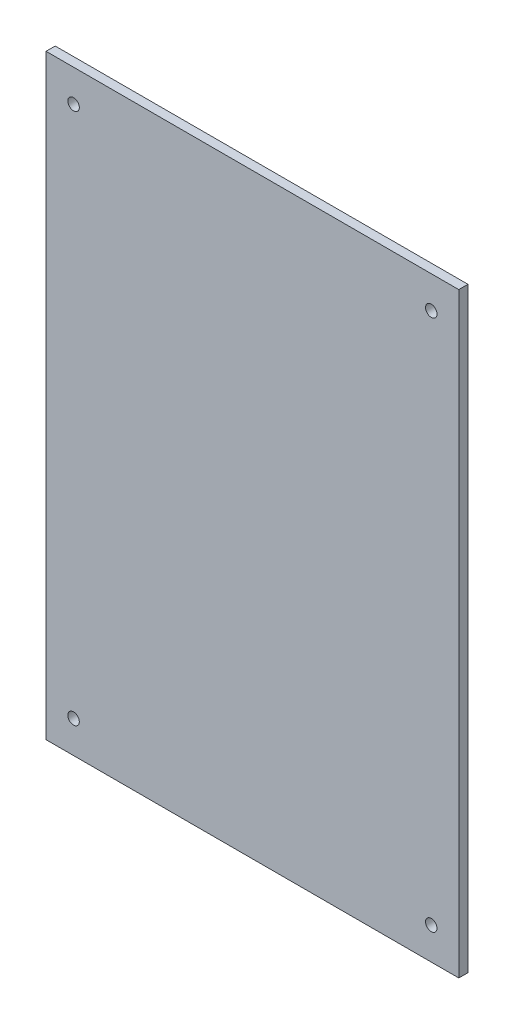
ISO-10303-21;
HEADER;
FILE_DESCRIPTION(('STEP AP214'),'2;1');
FILE_NAME('part.step','',(''),(''),'','','');
FILE_SCHEMA(('AUTOMOTIVE_DESIGN { 1 0 10303 214 1 1 1 1 }'));
ENDSEC;
DATA;
#1=APPLICATION_CONTEXT('core data for automotive mechanical design processes');
#2=APPLICATION_PROTOCOL_DEFINITION('international standard','automotive_design',2000,#1);
#3=PRODUCT_CONTEXT('',#1,'mechanical');
#4=PRODUCT('Part','Part','',(#3));
#5=PRODUCT_RELATED_PRODUCT_CATEGORY('part','',(#4));
#6=PRODUCT_DEFINITION_FORMATION('','',#4);
#7=PRODUCT_DEFINITION_CONTEXT('part definition',#1,'design');
#8=PRODUCT_DEFINITION('design','',#6,#7);
#9=PRODUCT_DEFINITION_SHAPE('','',#8);
#10=(LENGTH_UNIT() NAMED_UNIT(*) SI_UNIT(.MILLI.,.METRE.));
#11=(NAMED_UNIT(*) PLANE_ANGLE_UNIT() SI_UNIT($,.RADIAN.));
#12=(NAMED_UNIT(*) SI_UNIT($,.STERADIAN.) SOLID_ANGLE_UNIT());
#13=UNCERTAINTY_MEASURE_WITH_UNIT(LENGTH_MEASURE(1.E-05),#10,'distance_accuracy_value','');
#14=(GEOMETRIC_REPRESENTATION_CONTEXT(3) GLOBAL_UNCERTAINTY_ASSIGNED_CONTEXT((#13)) GLOBAL_UNIT_ASSIGNED_CONTEXT((#10,
#11,#12)) REPRESENTATION_CONTEXT('',''));
#15=CARTESIAN_POINT('',(0.,0.,0.));
#16=DIRECTION('',(0.,0.,1.));
#17=DIRECTION('',(1.,0.,0.));
#18=AXIS2_PLACEMENT_3D('',#15,#16,#17);
#19=CARTESIAN_POINT('',(0.,0.,4.));
#20=DIRECTION('',(0.,0.,-1.));
#21=DIRECTION('',(-1.,0.,0.));
#22=AXIS2_PLACEMENT_3D('',#19,#20,#21);
#23=PLANE('',#22);
#24=DIRECTION('',(0.,-1.,0.));
#25=VECTOR('',#24,1.);
#26=CARTESIAN_POINT('',(0.,0.,4.));
#27=LINE('',#26,#25);
#28=CARTESIAN_POINT('',(0.,260.,4.));
#29=VERTEX_POINT('',#28);
#30=CARTESIAN_POINT('',(0.,0.,4.));
#31=VERTEX_POINT('',#30);
#32=EDGE_CURVE('E91',#29,#31,#27,.T.);
#33=ORIENTED_EDGE('',*,*,#32,.T.);
#34=DIRECTION('',(1.,0.,0.));
#35=VECTOR('',#34,1.);
#36=CARTESIAN_POINT('',(0.,0.,4.));
#37=LINE('',#36,#35);
#38=CARTESIAN_POINT('',(180.,0.,4.));
#39=VERTEX_POINT('',#38);
#40=EDGE_CURVE('E86',#31,#39,#37,.T.);
#41=ORIENTED_EDGE('',*,*,#40,.T.);
#42=DIRECTION('',(0.,1.,0.));
#43=VECTOR('',#42,1.);
#44=CARTESIAN_POINT('',(180.,0.,4.));
#45=LINE('',#44,#43);
#46=CARTESIAN_POINT('',(180.,260.,4.));
#47=VERTEX_POINT('',#46);
#48=EDGE_CURVE('E87',#39,#47,#45,.T.);
#49=ORIENTED_EDGE('',*,*,#48,.T.);
#50=DIRECTION('',(-1.,0.,0.));
#51=VECTOR('',#50,1.);
#52=CARTESIAN_POINT('',(0.,260.,4.));
#53=LINE('',#52,#51);
#54=EDGE_CURVE('E57',#47,#29,#53,.T.);
#55=ORIENTED_EDGE('',*,*,#54,.T.);
#56=EDGE_LOOP('',(#33,#41,#49,#55));
#57=FACE_BOUND('',#56,.T.);
#58=CARTESIAN_POINT('',(12.,14.,4.));
#59=DIRECTION('',(0.,0.,1.));
#60=DIRECTION('',(1.,0.,0.));
#61=AXIS2_PLACEMENT_3D('',#58,#59,#60);
#62=CIRCLE('',#61,2.5);
#63=CARTESIAN_POINT('',(14.5,14.,4.));
#64=VERTEX_POINT('',#63);
#65=EDGE_CURVE('E106',#64,#64,#62,.T.);
#66=ORIENTED_EDGE('',*,*,#65,.F.);
#67=EDGE_LOOP('',(#66));
#68=FACE_BOUND('',#67,.T.);
#69=CARTESIAN_POINT('',(12.,246.,4.));
#70=DIRECTION('',(0.,0.,1.));
#71=DIRECTION('',(1.,0.,0.));
#72=AXIS2_PLACEMENT_3D('',#69,#70,#71);
#73=CIRCLE('',#72,2.5);
#74=CARTESIAN_POINT('',(14.5,246.,4.));
#75=VERTEX_POINT('',#74);
#76=EDGE_CURVE('E123',#75,#75,#73,.T.);
#77=ORIENTED_EDGE('',*,*,#76,.F.);
#78=EDGE_LOOP('',(#77));
#79=FACE_BOUND('',#78,.T.);
#80=CARTESIAN_POINT('',(168.,14.,4.));
#81=DIRECTION('',(0.,0.,1.));
#82=DIRECTION('',(1.,0.,0.));
#83=AXIS2_PLACEMENT_3D('',#80,#81,#82);
#84=CIRCLE('',#83,2.5);
#85=CARTESIAN_POINT('',(170.5,14.,4.));
#86=VERTEX_POINT('',#85);
#87=EDGE_CURVE('E130',#86,#86,#84,.T.);
#88=ORIENTED_EDGE('',*,*,#87,.F.);
#89=EDGE_LOOP('',(#88));
#90=FACE_BOUND('',#89,.T.);
#91=CARTESIAN_POINT('',(168.,246.,4.));
#92=DIRECTION('',(0.,0.,1.));
#93=DIRECTION('',(1.,0.,0.));
#94=AXIS2_PLACEMENT_3D('',#91,#92,#93);
#95=CIRCLE('',#94,2.5);
#96=CARTESIAN_POINT('',(170.5,246.,4.));
#97=VERTEX_POINT('',#96);
#98=EDGE_CURVE('E133',#97,#97,#95,.T.);
#99=ORIENTED_EDGE('',*,*,#98,.F.);
#100=EDGE_LOOP('',(#99));
#101=FACE_BOUND('',#100,.T.);
#102=ADVANCED_FACE('F39',(#57,#68,#79,#90,#101),#23,.F.);
#103=CARTESIAN_POINT('',(0.,0.,0.));
#104=DIRECTION('',(0.,0.,-1.));
#105=DIRECTION('',(-1.,0.,0.));
#106=AXIS2_PLACEMENT_3D('',#103,#104,#105);
#107=PLANE('',#106);
#108=CARTESIAN_POINT('',(168.,14.,0.));
#109=DIRECTION('',(0.,0.,1.));
#110=DIRECTION('',(1.,0.,0.));
#111=AXIS2_PLACEMENT_3D('',#108,#109,#110);
#112=CIRCLE('',#111,2.5);
#113=CARTESIAN_POINT('',(170.5,14.,0.));
#114=VERTEX_POINT('',#113);
#115=EDGE_CURVE('E127',#114,#114,#112,.T.);
#116=ORIENTED_EDGE('',*,*,#115,.T.);
#117=EDGE_LOOP('',(#116));
#118=FACE_BOUND('',#117,.T.);
#119=CARTESIAN_POINT('',(12.,14.,0.));
#120=DIRECTION('',(0.,0.,1.));
#121=DIRECTION('',(1.,0.,0.));
#122=AXIS2_PLACEMENT_3D('',#119,#120,#121);
#123=CIRCLE('',#122,2.5);
#124=CARTESIAN_POINT('',(14.5,14.,0.));
#125=VERTEX_POINT('',#124);
#126=EDGE_CURVE('E119',#125,#125,#123,.T.);
#127=ORIENTED_EDGE('',*,*,#126,.T.);
#128=EDGE_LOOP('',(#127));
#129=FACE_BOUND('',#128,.T.);
#130=DIRECTION('',(0.,-1.,0.));
#131=VECTOR('',#130,1.);
#132=CARTESIAN_POINT('',(0.,0.,0.));
#133=LINE('',#132,#131);
#134=CARTESIAN_POINT('',(0.,260.,0.));
#135=VERTEX_POINT('',#134);
#136=CARTESIAN_POINT('',(0.,0.,0.));
#137=VERTEX_POINT('',#136);
#138=EDGE_CURVE('E104',#135,#137,#133,.T.);
#139=ORIENTED_EDGE('',*,*,#138,.F.);
#140=DIRECTION('',(-1.,0.,0.));
#141=VECTOR('',#140,1.);
#142=CARTESIAN_POINT('',(0.,260.,0.));
#143=LINE('',#142,#141);
#144=CARTESIAN_POINT('',(180.,260.,0.));
#145=VERTEX_POINT('',#144);
#146=EDGE_CURVE('E80',#145,#135,#143,.T.);
#147=ORIENTED_EDGE('',*,*,#146,.F.);
#148=DIRECTION('',(0.,1.,0.));
#149=VECTOR('',#148,1.);
#150=CARTESIAN_POINT('',(180.,0.,0.));
#151=LINE('',#150,#149);
#152=CARTESIAN_POINT('',(180.,0.,0.));
#153=VERTEX_POINT('',#152);
#154=EDGE_CURVE('E74',#153,#145,#151,.T.);
#155=ORIENTED_EDGE('',*,*,#154,.F.);
#156=DIRECTION('',(1.,0.,0.));
#157=VECTOR('',#156,1.);
#158=CARTESIAN_POINT('',(0.,0.,0.));
#159=LINE('',#158,#157);
#160=EDGE_CURVE('E94',#137,#153,#159,.T.);
#161=ORIENTED_EDGE('',*,*,#160,.F.);
#162=EDGE_LOOP('',(#139,#147,#155,#161));
#163=FACE_BOUND('',#162,.T.);
#164=CARTESIAN_POINT('',(12.,246.,0.));
#165=DIRECTION('',(0.,0.,1.));
#166=DIRECTION('',(1.,0.,0.));
#167=AXIS2_PLACEMENT_3D('',#164,#165,#166);
#168=CIRCLE('',#167,2.5);
#169=CARTESIAN_POINT('',(14.5,246.,0.));
#170=VERTEX_POINT('',#169);
#171=EDGE_CURVE('E125',#170,#170,#168,.T.);
#172=ORIENTED_EDGE('',*,*,#171,.T.);
#173=EDGE_LOOP('',(#172));
#174=FACE_BOUND('',#173,.T.);
#175=CARTESIAN_POINT('',(168.,246.,0.));
#176=DIRECTION('',(0.,0.,1.));
#177=DIRECTION('',(1.,0.,0.));
#178=AXIS2_PLACEMENT_3D('',#175,#176,#177);
#179=CIRCLE('',#178,2.5);
#180=CARTESIAN_POINT('',(170.5,246.,0.));
#181=VERTEX_POINT('',#180);
#182=EDGE_CURVE('E136',#181,#181,#179,.T.);
#183=ORIENTED_EDGE('',*,*,#182,.T.);
#184=EDGE_LOOP('',(#183));
#185=FACE_BOUND('',#184,.T.);
#186=ADVANCED_FACE('F114',(#118,#129,#163,#174,#185),#107,.T.);
#187=CARTESIAN_POINT('',(0.,0.,4.));
#188=DIRECTION('',(1.,0.,0.));
#189=DIRECTION('',(0.,0.,-1.));
#190=AXIS2_PLACEMENT_3D('',#187,#188,#189);
#191=PLANE('',#190);
#192=ORIENTED_EDGE('',*,*,#138,.T.);
#193=DIRECTION('',(0.,0.,-1.));
#194=VECTOR('',#193,1.);
#195=CARTESIAN_POINT('',(0.,0.,4.));
#196=LINE('',#195,#194);
#197=EDGE_CURVE('E11',#31,#137,#196,.T.);
#198=ORIENTED_EDGE('',*,*,#197,.F.);
#199=ORIENTED_EDGE('',*,*,#32,.F.);
#200=DIRECTION('',(0.,0.,-1.));
#201=VECTOR('',#200,1.);
#202=CARTESIAN_POINT('',(0.,260.,4.));
#203=LINE('',#202,#201);
#204=EDGE_CURVE('E98',#29,#135,#203,.T.);
#205=ORIENTED_EDGE('',*,*,#204,.T.);
#206=EDGE_LOOP('',(#192,#198,#199,#205));
#207=FACE_BOUND('',#206,.T.);
#208=ADVANCED_FACE('F41',(#207),#191,.F.);
#209=CARTESIAN_POINT('',(0.,0.,4.));
#210=DIRECTION('',(0.,1.,0.));
#211=DIRECTION('',(0.,0.,1.));
#212=AXIS2_PLACEMENT_3D('',#209,#210,#211);
#213=PLANE('',#212);
#214=ORIENTED_EDGE('',*,*,#160,.T.);
#215=DIRECTION('',(0.,0.,-1.));
#216=VECTOR('',#215,1.);
#217=CARTESIAN_POINT('',(180.,0.,4.));
#218=LINE('',#217,#216);
#219=EDGE_CURVE('E48',#39,#153,#218,.T.);
#220=ORIENTED_EDGE('',*,*,#219,.F.);
#221=ORIENTED_EDGE('',*,*,#40,.F.);
#222=ORIENTED_EDGE('',*,*,#197,.T.);
#223=EDGE_LOOP('',(#214,#220,#221,#222));
#224=FACE_BOUND('',#223,.T.);
#225=ADVANCED_FACE('F92',(#224),#213,.F.);
#226=CARTESIAN_POINT('',(180.,0.,4.));
#227=DIRECTION('',(-1.,0.,0.));
#228=DIRECTION('',(0.,0.,1.));
#229=AXIS2_PLACEMENT_3D('',#226,#227,#228);
#230=PLANE('',#229);
#231=ORIENTED_EDGE('',*,*,#154,.T.);
#232=DIRECTION('',(0.,0.,-1.));
#233=VECTOR('',#232,1.);
#234=CARTESIAN_POINT('',(180.,260.,4.));
#235=LINE('',#234,#233);
#236=EDGE_CURVE('E96',#47,#145,#235,.T.);
#237=ORIENTED_EDGE('',*,*,#236,.F.);
#238=ORIENTED_EDGE('',*,*,#48,.F.);
#239=ORIENTED_EDGE('',*,*,#219,.T.);
#240=EDGE_LOOP('',(#231,#237,#238,#239));
#241=FACE_BOUND('',#240,.T.);
#242=ADVANCED_FACE('F100',(#241),#230,.F.);
#243=CARTESIAN_POINT('',(0.,260.,4.));
#244=DIRECTION('',(0.,-1.,0.));
#245=DIRECTION('',(0.,0.,-1.));
#246=AXIS2_PLACEMENT_3D('',#243,#244,#245);
#247=PLANE('',#246);
#248=ORIENTED_EDGE('',*,*,#146,.T.);
#249=ORIENTED_EDGE('',*,*,#204,.F.);
#250=ORIENTED_EDGE('',*,*,#54,.F.);
#251=ORIENTED_EDGE('',*,*,#236,.T.);
#252=EDGE_LOOP('',(#248,#249,#250,#251));
#253=FACE_BOUND('',#252,.T.);
#254=ADVANCED_FACE('F112',(#253),#247,.F.);
#255=CARTESIAN_POINT('',(12.,14.,4.));
#256=DIRECTION('',(0.,0.,-1.));
#257=DIRECTION('',(-1.,0.,0.));
#258=AXIS2_PLACEMENT_3D('',#255,#256,#257);
#259=CYLINDRICAL_SURFACE('',#258,2.5);
#260=ORIENTED_EDGE('',*,*,#65,.T.);
#261=EDGE_LOOP('',(#260));
#262=FACE_BOUND('',#261,.T.);
#263=ORIENTED_EDGE('',*,*,#126,.F.);
#264=EDGE_LOOP('',(#263));
#265=FACE_BOUND('',#264,.T.);
#266=ADVANCED_FACE('F154',(#262,#265),#259,.F.);
#267=CARTESIAN_POINT('',(12.,246.,4.));
#268=DIRECTION('',(0.,0.,-1.));
#269=DIRECTION('',(-1.,0.,0.));
#270=AXIS2_PLACEMENT_3D('',#267,#268,#269);
#271=CYLINDRICAL_SURFACE('',#270,2.5);
#272=ORIENTED_EDGE('',*,*,#76,.T.);
#273=EDGE_LOOP('',(#272));
#274=FACE_BOUND('',#273,.T.);
#275=ORIENTED_EDGE('',*,*,#171,.F.);
#276=EDGE_LOOP('',(#275));
#277=FACE_BOUND('',#276,.T.);
#278=ADVANCED_FACE('F199',(#274,#277),#271,.F.);
#279=CARTESIAN_POINT('',(168.,14.,4.));
#280=DIRECTION('',(0.,0.,-1.));
#281=DIRECTION('',(-1.,0.,0.));
#282=AXIS2_PLACEMENT_3D('',#279,#280,#281);
#283=CYLINDRICAL_SURFACE('',#282,2.5);
#284=ORIENTED_EDGE('',*,*,#87,.T.);
#285=EDGE_LOOP('',(#284));
#286=FACE_BOUND('',#285,.T.);
#287=ORIENTED_EDGE('',*,*,#115,.F.);
#288=EDGE_LOOP('',(#287));
#289=FACE_BOUND('',#288,.T.);
#290=ADVANCED_FACE('F206',(#286,#289),#283,.F.);
#291=CARTESIAN_POINT('',(168.,246.,4.));
#292=DIRECTION('',(0.,0.,-1.));
#293=DIRECTION('',(-1.,0.,0.));
#294=AXIS2_PLACEMENT_3D('',#291,#292,#293);
#295=CYLINDRICAL_SURFACE('',#294,2.5);
#296=ORIENTED_EDGE('',*,*,#98,.T.);
#297=EDGE_LOOP('',(#296));
#298=FACE_BOUND('',#297,.T.);
#299=ORIENTED_EDGE('',*,*,#182,.F.);
#300=EDGE_LOOP('',(#299));
#301=FACE_BOUND('',#300,.T.);
#302=ADVANCED_FACE('F145',(#298,#301),#295,.F.);
#303=CLOSED_SHELL('',(#102,#186,#208,#225,#242,#254,#266,#278,#290,#302));
#304=MANIFOLD_SOLID_BREP('B2',#303);
#305=ADVANCED_BREP_SHAPE_REPRESENTATION('',(#18,#304),#14);
#306=SHAPE_DEFINITION_REPRESENTATION(#9,#305);
ENDSEC;
END-ISO-10303-21;
